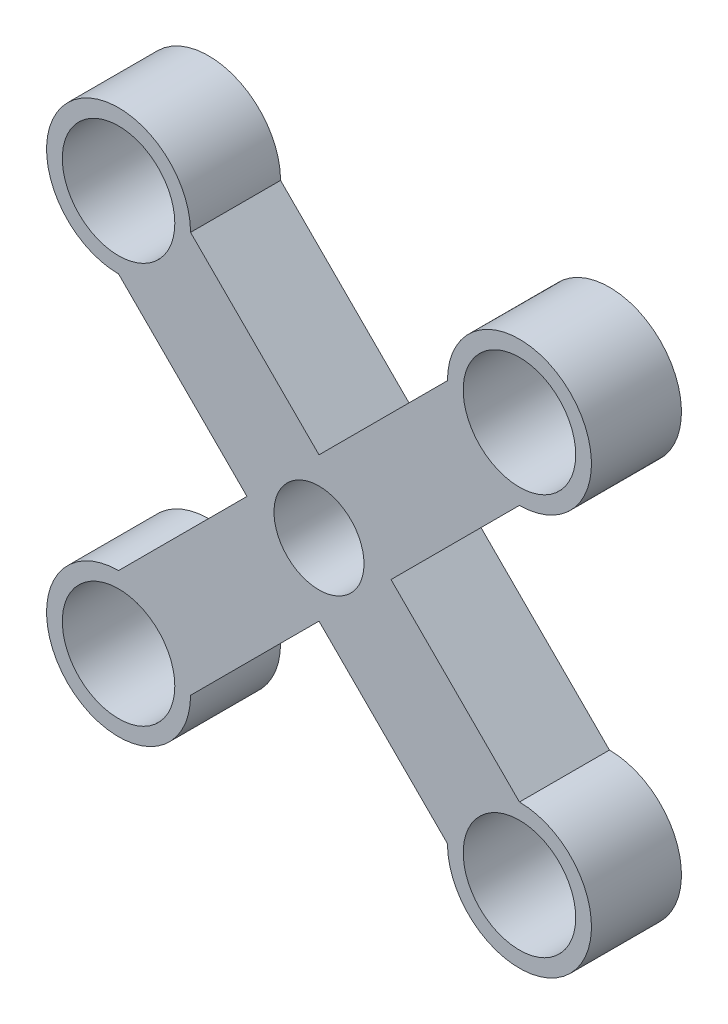
ISO-10303-21;
HEADER;
FILE_DESCRIPTION(('STEP AP214'),'2;1');
FILE_NAME('part.step','',(''),(''),'','','');
FILE_SCHEMA(('AUTOMOTIVE_DESIGN { 1 0 10303 214 1 1 1 1 }'));
ENDSEC;
DATA;
#1=APPLICATION_CONTEXT('core data for automotive mechanical design processes');
#2=APPLICATION_PROTOCOL_DEFINITION('international standard','automotive_design',2000,#1);
#3=PRODUCT_CONTEXT('',#1,'mechanical');
#4=PRODUCT('Part','Part','',(#3));
#5=PRODUCT_RELATED_PRODUCT_CATEGORY('part','',(#4));
#6=PRODUCT_DEFINITION_FORMATION('','',#4);
#7=PRODUCT_DEFINITION_CONTEXT('part definition',#1,'design');
#8=PRODUCT_DEFINITION('design','',#6,#7);
#9=PRODUCT_DEFINITION_SHAPE('','',#8);
#10=(LENGTH_UNIT() NAMED_UNIT(*) SI_UNIT(.MILLI.,.METRE.));
#11=(NAMED_UNIT(*) PLANE_ANGLE_UNIT() SI_UNIT($,.RADIAN.));
#12=(NAMED_UNIT(*) SI_UNIT($,.STERADIAN.) SOLID_ANGLE_UNIT());
#13=UNCERTAINTY_MEASURE_WITH_UNIT(LENGTH_MEASURE(1.E-05),#10,'distance_accuracy_value','');
#14=(GEOMETRIC_REPRESENTATION_CONTEXT(3) GLOBAL_UNCERTAINTY_ASSIGNED_CONTEXT((#13)) GLOBAL_UNIT_ASSIGNED_CONTEXT((#10,
#11,#12)) REPRESENTATION_CONTEXT('',''));
#15=CARTESIAN_POINT('',(0.,0.,0.));
#16=DIRECTION('',(0.,0.,1.));
#17=DIRECTION('',(1.,0.,0.));
#18=AXIS2_PLACEMENT_3D('',#15,#16,#17);
#19=CARTESIAN_POINT('',(-28.2107604692687,-28.4110048214787,12.7));
#20=DIRECTION('',(0.,0.,1.));
#21=DIRECTION('',(1.,0.,0.));
#22=AXIS2_PLACEMENT_3D('',#19,#20,#21);
#23=PLANE('',#22);
#24=CARTESIAN_POINT('',(-28.2107604692687,-28.4110048214787,12.7));
#25=DIRECTION('',(0.,0.,1.));
#26=DIRECTION('',(1.,0.,0.));
#27=AXIS2_PLACEMENT_3D('',#24,#25,#26);
#28=CIRCLE('',#27,7.9375);
#29=CARTESIAN_POINT('',(-20.2732604692687,-28.4110048214787,12.7));
#30=VERTEX_POINT('',#29);
#31=EDGE_CURVE('E305',#30,#30,#28,.T.);
#32=ORIENTED_EDGE('',*,*,#31,.F.);
#33=EDGE_LOOP('',(#32));
#34=FACE_BOUND('',#33,.T.);
#35=CARTESIAN_POINT('',(28.3576688885565,28.1574245363542,12.7));
#36=DIRECTION('',(0.,0.,1.));
#37=DIRECTION('',(1.,0.,0.));
#38=AXIS2_PLACEMENT_3D('',#35,#36,#37);
#39=CIRCLE('',#38,7.9375);
#40=CARTESIAN_POINT('',(36.2951688885565,28.1574245363542,12.7));
#41=VERTEX_POINT('',#40);
#42=EDGE_CURVE('E317',#41,#41,#39,.T.);
#43=ORIENTED_EDGE('',*,*,#42,.F.);
#44=EDGE_LOOP('',(#43));
#45=FACE_BOUND('',#44,.T.);
#46=CARTESIAN_POINT('',(-28.2107604692687,-28.4110048214787,12.7));
#47=DIRECTION('',(0.,0.,1.));
#48=DIRECTION('',(1.,0.,0.));
#49=AXIS2_PLACEMENT_3D('',#46,#47,#48);
#50=CIRCLE('',#49,10.1599999999999);
#51=CARTESIAN_POINT('',(-28.2107604692687,-18.251004821479,12.7));
#52=VERTEX_POINT('',#51);
#53=CARTESIAN_POINT('',(-18.0507604692687,-28.411004821479,12.7));
#54=VERTEX_POINT('',#53);
#55=EDGE_CURVE('E187',#52,#54,#50,.T.);
#56=ORIENTED_EDGE('',*,*,#55,.T.);
#57=DIRECTION('',(0.707106781186543,0.707106781186552,0.));
#58=VECTOR('',#57,1.);
#59=CARTESIAN_POINT('',(0.0734542096488229,-10.2867901425613,12.7));
#60=LINE('',#59,#58);
#61=CARTESIAN_POINT('',(0.0734542096488229,-10.2867901425613,12.7));
#62=VERTEX_POINT('',#61);
#63=EDGE_CURVE('E115',#54,#62,#60,.T.);
#64=ORIENTED_EDGE('',*,*,#63,.T.);
#65=DIRECTION('',(0.707106781186547,-0.707106781186547,0.));
#66=VECTOR('',#65,1.);
#67=CARTESIAN_POINT('',(18.1976688885615,-28.4110048214739,12.7));
#68=LINE('',#67,#66);
#69=CARTESIAN_POINT('',(18.1976688885616,-28.4110048214739,12.7));
#70=VERTEX_POINT('',#69);
#71=EDGE_CURVE('E214',#62,#70,#68,.T.);
#72=ORIENTED_EDGE('',*,*,#71,.T.);
#73=CARTESIAN_POINT('',(28.3576688885603,-28.4110048214739,12.7));
#74=DIRECTION('',(0.,0.,1.));
#75=DIRECTION('',(1.,0.,0.));
#76=AXIS2_PLACEMENT_3D('',#73,#74,#75);
#77=CIRCLE('',#76,10.1599999999987);
#78=CARTESIAN_POINT('',(28.3576688885601,-18.2510048214753,12.7));
#79=VERTEX_POINT('',#78);
#80=EDGE_CURVE('E233',#70,#79,#77,.T.);
#81=ORIENTED_EDGE('',*,*,#80,.T.);
#82=DIRECTION('',(-0.707106781186541,0.707106781186554,0.));
#83=VECTOR('',#82,1.);
#84=CARTESIAN_POINT('',(28.3576688885601,-18.2510048214753,12.7));
#85=LINE('',#84,#83);
#86=CARTESIAN_POINT('',(10.2334542096477,-0.126790142562578,12.7));
#87=VERTEX_POINT('',#86);
#88=EDGE_CURVE('E230',#79,#87,#85,.T.);
#89=ORIENTED_EDGE('',*,*,#88,.T.);
#90=DIRECTION('',(0.707106781186554,0.70710678118654,0.));
#91=VECTOR('',#90,1.);
#92=CARTESIAN_POINT('',(28.3576688885602,17.9974245363496,12.7));
#93=LINE('',#92,#91);
#94=CARTESIAN_POINT('',(28.3576688885602,17.9974245363496,12.7));
#95=VERTEX_POINT('',#94);
#96=EDGE_CURVE('E232',#87,#95,#93,.T.);
#97=ORIENTED_EDGE('',*,*,#96,.T.);
#98=CARTESIAN_POINT('',(28.3576688885602,28.1574245363498,12.7));
#99=DIRECTION('',(0.,0.,1.));
#100=DIRECTION('',(1.,0.,0.));
#101=AXIS2_PLACEMENT_3D('',#98,#99,#100);
#102=CIRCLE('',#101,10.1600000000002);
#103=CARTESIAN_POINT('',(18.1976688885601,28.1574245363498,12.7));
#104=VERTEX_POINT('',#103);
#105=EDGE_CURVE('E235',#95,#104,#102,.T.);
#106=ORIENTED_EDGE('',*,*,#105,.T.);
#107=DIRECTION('',(-0.707106781186548,-0.707106781186548,0.));
#108=VECTOR('',#107,1.);
#109=CARTESIAN_POINT('',(0.0734542096477156,10.0332098574374,12.7));
#110=LINE('',#109,#108);
#111=CARTESIAN_POINT('',(0.0734542096477156,10.0332098574374,12.7));
#112=VERTEX_POINT('',#111);
#113=EDGE_CURVE('E241',#104,#112,#110,.T.);
#114=ORIENTED_EDGE('',*,*,#113,.T.);
#115=DIRECTION('',(-0.707106781186547,0.707106781186547,0.));
#116=VECTOR('',#115,1.);
#117=CARTESIAN_POINT('',(0.0734542096477156,10.0332098574374,12.7));
#118=LINE('',#117,#116);
#119=CARTESIAN_POINT('',(-18.0507604692723,28.1574245363575,12.7));
#120=VERTEX_POINT('',#119);
#121=EDGE_CURVE('E146',#112,#120,#118,.T.);
#122=ORIENTED_EDGE('',*,*,#121,.T.);
#123=CARTESIAN_POINT('',(-28.2107604692709,28.1574245363571,12.7));
#124=DIRECTION('',(0.,0.,1.));
#125=DIRECTION('',(1.,0.,0.));
#126=AXIS2_PLACEMENT_3D('',#123,#124,#125);
#127=CIRCLE('',#126,10.1599999999986);
#128=CARTESIAN_POINT('',(-28.2107604692709,17.9974245363585,12.7));
#129=VERTEX_POINT('',#128);
#130=EDGE_CURVE('E140',#120,#129,#127,.T.);
#131=ORIENTED_EDGE('',*,*,#130,.T.);
#132=DIRECTION('',(0.707106781186548,-0.707106781186548,0.));
#133=VECTOR('',#132,1.);
#134=CARTESIAN_POINT('',(-10.0865457903511,-0.126790142561367,12.7));
#135=LINE('',#134,#133);
#136=CARTESIAN_POINT('',(-10.0865457903511,-0.126790142561367,12.7));
#137=VERTEX_POINT('',#136);
#138=EDGE_CURVE('E144',#129,#137,#135,.T.);
#139=ORIENTED_EDGE('',*,*,#138,.T.);
#140=DIRECTION('',(-0.707106781186548,-0.707106781186548,0.));
#141=VECTOR('',#140,1.);
#142=CARTESIAN_POINT('',(-28.2107604692687,-18.251004821479,12.7));
#143=LINE('',#142,#141);
#144=EDGE_CURVE('E60',#137,#52,#143,.T.);
#145=ORIENTED_EDGE('',*,*,#144,.T.);
#146=EDGE_LOOP('',(#56,#64,#72,#81,#89,#97,#106,#114,#122,#131,#139,#145));
#147=FACE_BOUND('',#146,.T.);
#148=CARTESIAN_POINT('',(-28.2107604692709,28.1574245363571,12.7));
#149=DIRECTION('',(0.,0.,1.));
#150=DIRECTION('',(1.,0.,0.));
#151=AXIS2_PLACEMENT_3D('',#148,#149,#150);
#152=CIRCLE('',#151,7.9375);
#153=CARTESIAN_POINT('',(-20.2732604692709,28.1574245363571,12.7));
#154=VERTEX_POINT('',#153);
#155=EDGE_CURVE('E168',#154,#154,#152,.T.);
#156=ORIENTED_EDGE('',*,*,#155,.F.);
#157=EDGE_LOOP('',(#156));
#158=FACE_BOUND('',#157,.T.);
#159=CARTESIAN_POINT('',(28.3576688885607,-28.4110048214747,12.7));
#160=DIRECTION('',(0.,0.,1.));
#161=DIRECTION('',(1.,0.,0.));
#162=AXIS2_PLACEMENT_3D('',#159,#160,#161);
#163=CIRCLE('',#162,7.9375);
#164=CARTESIAN_POINT('',(36.2951688885607,-28.4110048214747,12.7));
#165=VERTEX_POINT('',#164);
#166=EDGE_CURVE('E311',#165,#165,#163,.T.);
#167=ORIENTED_EDGE('',*,*,#166,.F.);
#168=EDGE_LOOP('',(#167));
#169=FACE_BOUND('',#168,.T.);
#170=CARTESIAN_POINT('',(0.0734542096446078,-0.126790142561978,12.7));
#171=DIRECTION('',(0.,0.,1.));
#172=DIRECTION('',(1.,0.,0.));
#173=AXIS2_PLACEMENT_3D('',#170,#171,#172);
#174=CIRCLE('',#173,6.34999999999903);
#175=CARTESIAN_POINT('',(6.42345420964364,-0.126790142561978,12.7));
#176=VERTEX_POINT('',#175);
#177=EDGE_CURVE('E296',#176,#176,#174,.T.);
#178=ORIENTED_EDGE('',*,*,#177,.F.);
#179=EDGE_LOOP('',(#178));
#180=FACE_BOUND('',#179,.T.);
#181=ADVANCED_FACE('F43',(#34,#45,#147,#158,#169,#180),#23,.T.);
#182=CARTESIAN_POINT('',(-28.2107604692687,-28.4110048214787,0.));
#183=DIRECTION('',(0.,0.,1.));
#184=DIRECTION('',(1.,0.,0.));
#185=AXIS2_PLACEMENT_3D('',#182,#183,#184);
#186=PLANE('',#185);
#187=CARTESIAN_POINT('',(-28.2107604692687,-28.4110048214787,0.));
#188=DIRECTION('',(0.,0.,1.));
#189=DIRECTION('',(1.,0.,0.));
#190=AXIS2_PLACEMENT_3D('',#187,#188,#189);
#191=CIRCLE('',#190,10.1599999999999);
#192=CARTESIAN_POINT('',(-28.2107604692687,-18.251004821479,0.));
#193=VERTEX_POINT('',#192);
#194=CARTESIAN_POINT('',(-18.0507604692687,-28.411004821479,0.));
#195=VERTEX_POINT('',#194);
#196=EDGE_CURVE('E164',#193,#195,#191,.T.);
#197=ORIENTED_EDGE('',*,*,#196,.F.);
#198=DIRECTION('',(-0.707106781186548,-0.707106781186548,0.));
#199=VECTOR('',#198,1.);
#200=CARTESIAN_POINT('',(-28.2107604692687,-18.251004821479,0.));
#201=LINE('',#200,#199);
#202=CARTESIAN_POINT('',(-10.0865457903511,-0.126790142561367,0.));
#203=VERTEX_POINT('',#202);
#204=EDGE_CURVE('E107',#203,#193,#201,.T.);
#205=ORIENTED_EDGE('',*,*,#204,.F.);
#206=DIRECTION('',(0.707106781186548,-0.707106781186548,0.));
#207=VECTOR('',#206,1.);
#208=CARTESIAN_POINT('',(-10.0865457903511,-0.126790142561367,0.));
#209=LINE('',#208,#207);
#210=CARTESIAN_POINT('',(-28.2107604692709,17.9974245363585,0.));
#211=VERTEX_POINT('',#210);
#212=EDGE_CURVE('E101',#211,#203,#209,.T.);
#213=ORIENTED_EDGE('',*,*,#212,.F.);
#214=CARTESIAN_POINT('',(-28.2107604692709,28.1574245363571,0.));
#215=DIRECTION('',(0.,0.,1.));
#216=DIRECTION('',(1.,0.,0.));
#217=AXIS2_PLACEMENT_3D('',#214,#215,#216);
#218=CIRCLE('',#217,10.1599999999986);
#219=CARTESIAN_POINT('',(-18.0507604692723,28.1574245363575,0.));
#220=VERTEX_POINT('',#219);
#221=EDGE_CURVE('E154',#220,#211,#218,.T.);
#222=ORIENTED_EDGE('',*,*,#221,.F.);
#223=DIRECTION('',(-0.707106781186547,0.707106781186547,0.));
#224=VECTOR('',#223,1.);
#225=CARTESIAN_POINT('',(0.0734542096477156,10.0332098574374,0.));
#226=LINE('',#225,#224);
#227=CARTESIAN_POINT('',(0.0734542096477156,10.0332098574374,0.));
#228=VERTEX_POINT('',#227);
#229=EDGE_CURVE('E182',#228,#220,#226,.T.);
#230=ORIENTED_EDGE('',*,*,#229,.F.);
#231=DIRECTION('',(-0.707106781186548,-0.707106781186548,0.));
#232=VECTOR('',#231,1.);
#233=CARTESIAN_POINT('',(0.0734542096477156,10.0332098574374,0.));
#234=LINE('',#233,#232);
#235=CARTESIAN_POINT('',(18.1976688885601,28.1574245363498,0.));
#236=VERTEX_POINT('',#235);
#237=EDGE_CURVE('E180',#236,#228,#234,.T.);
#238=ORIENTED_EDGE('',*,*,#237,.F.);
#239=CARTESIAN_POINT('',(28.3576688885602,28.1574245363498,0.));
#240=DIRECTION('',(0.,0.,1.));
#241=DIRECTION('',(1.,0.,0.));
#242=AXIS2_PLACEMENT_3D('',#239,#240,#241);
#243=CIRCLE('',#242,10.1600000000002);
#244=CARTESIAN_POINT('',(28.3576688885602,17.9974245363496,0.));
#245=VERTEX_POINT('',#244);
#246=EDGE_CURVE('E178',#245,#236,#243,.T.);
#247=ORIENTED_EDGE('',*,*,#246,.F.);
#248=DIRECTION('',(0.707106781186554,0.70710678118654,0.));
#249=VECTOR('',#248,1.);
#250=CARTESIAN_POINT('',(28.3576688885602,17.9974245363496,0.));
#251=LINE('',#250,#249);
#252=CARTESIAN_POINT('',(10.2334542096477,-0.126790142562578,0.));
#253=VERTEX_POINT('',#252);
#254=EDGE_CURVE('E176',#253,#245,#251,.T.);
#255=ORIENTED_EDGE('',*,*,#254,.F.);
#256=DIRECTION('',(-0.707106781186541,0.707106781186554,0.));
#257=VECTOR('',#256,1.);
#258=CARTESIAN_POINT('',(28.3576688885601,-18.2510048214753,0.));
#259=LINE('',#258,#257);
#260=CARTESIAN_POINT('',(28.3576688885601,-18.2510048214753,0.));
#261=VERTEX_POINT('',#260);
#262=EDGE_CURVE('E174',#261,#253,#259,.T.);
#263=ORIENTED_EDGE('',*,*,#262,.F.);
#264=CARTESIAN_POINT('',(28.3576688885603,-28.4110048214739,0.));
#265=DIRECTION('',(0.,0.,1.));
#266=DIRECTION('',(1.,0.,0.));
#267=AXIS2_PLACEMENT_3D('',#264,#265,#266);
#268=CIRCLE('',#267,10.1599999999987);
#269=CARTESIAN_POINT('',(18.1976688885616,-28.4110048214739,0.));
#270=VERTEX_POINT('',#269);
#271=EDGE_CURVE('E172',#270,#261,#268,.T.);
#272=ORIENTED_EDGE('',*,*,#271,.F.);
#273=DIRECTION('',(0.707106781186547,-0.707106781186547,0.));
#274=VECTOR('',#273,1.);
#275=CARTESIAN_POINT('',(18.1976688885615,-28.4110048214739,0.));
#276=LINE('',#275,#274);
#277=CARTESIAN_POINT('',(0.0734542096488229,-10.2867901425613,0.));
#278=VERTEX_POINT('',#277);
#279=EDGE_CURVE('E170',#278,#270,#276,.T.);
#280=ORIENTED_EDGE('',*,*,#279,.F.);
#281=DIRECTION('',(0.707106781186543,0.707106781186552,0.));
#282=VECTOR('',#281,1.);
#283=CARTESIAN_POINT('',(0.0734542096488229,-10.2867901425613,0.));
#284=LINE('',#283,#282);
#285=EDGE_CURVE('E167',#195,#278,#284,.T.);
#286=ORIENTED_EDGE('',*,*,#285,.F.);
#287=EDGE_LOOP('',(#197,#205,#213,#222,#230,#238,#247,#255,#263,#272,#280,#286));
#288=FACE_BOUND('',#287,.T.);
#289=CARTESIAN_POINT('',(-28.2107604692709,28.1574245363571,0.));
#290=DIRECTION('',(0.,0.,1.));
#291=DIRECTION('',(1.,0.,0.));
#292=AXIS2_PLACEMENT_3D('',#289,#290,#291);
#293=CIRCLE('',#292,7.9375);
#294=CARTESIAN_POINT('',(-20.2732604692709,28.1574245363571,0.));
#295=VERTEX_POINT('',#294);
#296=EDGE_CURVE('E320',#295,#295,#293,.T.);
#297=ORIENTED_EDGE('',*,*,#296,.T.);
#298=EDGE_LOOP('',(#297));
#299=FACE_BOUND('',#298,.T.);
#300=CARTESIAN_POINT('',(28.3576688885565,28.1574245363542,0.));
#301=DIRECTION('',(0.,0.,1.));
#302=DIRECTION('',(1.,0.,0.));
#303=AXIS2_PLACEMENT_3D('',#300,#301,#302);
#304=CIRCLE('',#303,7.9375);
#305=CARTESIAN_POINT('',(36.2951688885565,28.1574245363542,0.));
#306=VERTEX_POINT('',#305);
#307=EDGE_CURVE('E314',#306,#306,#304,.T.);
#308=ORIENTED_EDGE('',*,*,#307,.T.);
#309=EDGE_LOOP('',(#308));
#310=FACE_BOUND('',#309,.T.);
#311=CARTESIAN_POINT('',(28.3576688885607,-28.4110048214747,0.));
#312=DIRECTION('',(0.,0.,1.));
#313=DIRECTION('',(1.,0.,0.));
#314=AXIS2_PLACEMENT_3D('',#311,#312,#313);
#315=CIRCLE('',#314,7.9375);
#316=CARTESIAN_POINT('',(36.2951688885607,-28.4110048214747,0.));
#317=VERTEX_POINT('',#316);
#318=EDGE_CURVE('E308',#317,#317,#315,.T.);
#319=ORIENTED_EDGE('',*,*,#318,.T.);
#320=EDGE_LOOP('',(#319));
#321=FACE_BOUND('',#320,.T.);
#322=CARTESIAN_POINT('',(-28.2107604692687,-28.4110048214787,0.));
#323=DIRECTION('',(0.,0.,1.));
#324=DIRECTION('',(1.,0.,0.));
#325=AXIS2_PLACEMENT_3D('',#322,#323,#324);
#326=CIRCLE('',#325,7.9375);
#327=CARTESIAN_POINT('',(-20.2732604692687,-28.4110048214787,0.));
#328=VERTEX_POINT('',#327);
#329=EDGE_CURVE('E302',#328,#328,#326,.T.);
#330=ORIENTED_EDGE('',*,*,#329,.T.);
#331=EDGE_LOOP('',(#330));
#332=FACE_BOUND('',#331,.T.);
#333=CARTESIAN_POINT('',(0.0734542096446078,-0.126790142561978,0.));
#334=DIRECTION('',(0.,0.,1.));
#335=DIRECTION('',(1.,0.,0.));
#336=AXIS2_PLACEMENT_3D('',#333,#334,#335);
#337=CIRCLE('',#336,6.34999999999903);
#338=CARTESIAN_POINT('',(6.42345420964364,-0.126790142561978,0.));
#339=VERTEX_POINT('',#338);
#340=EDGE_CURVE('E299',#339,#339,#337,.T.);
#341=ORIENTED_EDGE('',*,*,#340,.T.);
#342=EDGE_LOOP('',(#341));
#343=FACE_BOUND('',#342,.T.);
#344=ADVANCED_FACE('F218',(#288,#299,#310,#321,#332,#343),#186,.F.);
#345=CARTESIAN_POINT('',(-28.2107604692687,-28.4110048214787,12.7));
#346=DIRECTION('',(0.,0.,-1.));
#347=DIRECTION('',(-1.,0.,0.));
#348=AXIS2_PLACEMENT_3D('',#345,#346,#347);
#349=CYLINDRICAL_SURFACE('',#348,10.1599999999999);
#350=ORIENTED_EDGE('',*,*,#196,.T.);
#351=DIRECTION('',(0.,0.,-1.));
#352=VECTOR('',#351,1.);
#353=CARTESIAN_POINT('',(-18.0507604692687,-28.411004821479,12.7));
#354=LINE('',#353,#352);
#355=EDGE_CURVE('E11',#54,#195,#354,.T.);
#356=ORIENTED_EDGE('',*,*,#355,.F.);
#357=ORIENTED_EDGE('',*,*,#55,.F.);
#358=DIRECTION('',(0.,0.,-1.));
#359=VECTOR('',#358,1.);
#360=CARTESIAN_POINT('',(-28.2107604692687,-18.251004821479,12.7));
#361=LINE('',#360,#359);
#362=EDGE_CURVE('E160',#52,#193,#361,.T.);
#363=ORIENTED_EDGE('',*,*,#362,.T.);
#364=EDGE_LOOP('',(#350,#356,#357,#363));
#365=FACE_BOUND('',#364,.T.);
#366=ADVANCED_FACE('F45',(#365),#349,.T.);
#367=CARTESIAN_POINT('',(0.0734542096488229,-10.2867901425613,12.7));
#368=DIRECTION('',(-0.707106781186552,0.707106781186543,0.));
#369=DIRECTION('',(-0.707106781186543,-0.707106781186552,0.));
#370=AXIS2_PLACEMENT_3D('',#367,#368,#369);
#371=PLANE('',#370);
#372=ORIENTED_EDGE('',*,*,#285,.T.);
#373=DIRECTION('',(0.,0.,-1.));
#374=VECTOR('',#373,1.);
#375=CARTESIAN_POINT('',(0.0734542096488229,-10.2867901425613,12.7));
#376=LINE('',#375,#374);
#377=EDGE_CURVE('E52',#62,#278,#376,.T.);
#378=ORIENTED_EDGE('',*,*,#377,.F.);
#379=ORIENTED_EDGE('',*,*,#63,.F.);
#380=ORIENTED_EDGE('',*,*,#355,.T.);
#381=EDGE_LOOP('',(#372,#378,#379,#380));
#382=FACE_BOUND('',#381,.T.);
#383=ADVANCED_FACE('F444',(#382),#371,.F.);
#384=CARTESIAN_POINT('',(18.1976688885615,-28.4110048214739,12.7));
#385=DIRECTION('',(0.707106781186548,0.707106781186548,0.));
#386=DIRECTION('',(-0.707106781186548,0.707106781186548,0.));
#387=AXIS2_PLACEMENT_3D('',#384,#385,#386);
#388=PLANE('',#387);
#389=ORIENTED_EDGE('',*,*,#279,.T.);
#390=DIRECTION('',(0.,0.,-1.));
#391=VECTOR('',#390,1.);
#392=CARTESIAN_POINT('',(18.1976688885616,-28.4110048214739,12.7));
#393=LINE('',#392,#391);
#394=EDGE_CURVE('E206',#70,#270,#393,.T.);
#395=ORIENTED_EDGE('',*,*,#394,.F.);
#396=ORIENTED_EDGE('',*,*,#71,.F.);
#397=ORIENTED_EDGE('',*,*,#377,.T.);
#398=EDGE_LOOP('',(#389,#395,#396,#397));
#399=FACE_BOUND('',#398,.T.);
#400=ADVANCED_FACE('F212',(#399),#388,.F.);
#401=CARTESIAN_POINT('',(28.3576688885603,-28.4110048214739,12.7));
#402=DIRECTION('',(0.,0.,-1.));
#403=DIRECTION('',(-1.,0.,0.));
#404=AXIS2_PLACEMENT_3D('',#401,#402,#403);
#405=CYLINDRICAL_SURFACE('',#404,10.1599999999987);
#406=ORIENTED_EDGE('',*,*,#271,.T.);
#407=DIRECTION('',(0.,0.,-1.));
#408=VECTOR('',#407,1.);
#409=CARTESIAN_POINT('',(28.3576688885601,-18.2510048214753,12.7));
#410=LINE('',#409,#408);
#411=EDGE_CURVE('E203',#79,#261,#410,.T.);
#412=ORIENTED_EDGE('',*,*,#411,.F.);
#413=ORIENTED_EDGE('',*,*,#80,.F.);
#414=ORIENTED_EDGE('',*,*,#394,.T.);
#415=EDGE_LOOP('',(#406,#412,#413,#414));
#416=FACE_BOUND('',#415,.T.);
#417=ADVANCED_FACE('F224',(#416),#405,.T.);
#418=CARTESIAN_POINT('',(28.3576688885601,-18.2510048214753,12.7));
#419=DIRECTION('',(-0.707106781186554,-0.707106781186541,0.));
#420=DIRECTION('',(0.707106781186541,-0.707106781186554,0.));
#421=AXIS2_PLACEMENT_3D('',#418,#419,#420);
#422=PLANE('',#421);
#423=ORIENTED_EDGE('',*,*,#262,.T.);
#424=DIRECTION('',(0.,0.,-1.));
#425=VECTOR('',#424,1.);
#426=CARTESIAN_POINT('',(10.2334542096477,-0.126790142562578,12.7));
#427=LINE('',#426,#425);
#428=EDGE_CURVE('E200',#87,#253,#427,.T.);
#429=ORIENTED_EDGE('',*,*,#428,.F.);
#430=ORIENTED_EDGE('',*,*,#88,.F.);
#431=ORIENTED_EDGE('',*,*,#411,.T.);
#432=EDGE_LOOP('',(#423,#429,#430,#431));
#433=FACE_BOUND('',#432,.T.);
#434=ADVANCED_FACE('F228',(#433),#422,.F.);
#435=CARTESIAN_POINT('',(28.3576688885602,17.9974245363496,12.7));
#436=DIRECTION('',(-0.707106781186541,0.707106781186554,0.));
#437=DIRECTION('',(-0.707106781186554,-0.707106781186541,0.));
#438=AXIS2_PLACEMENT_3D('',#435,#436,#437);
#439=PLANE('',#438);
#440=ORIENTED_EDGE('',*,*,#254,.T.);
#441=DIRECTION('',(0.,0.,-1.));
#442=VECTOR('',#441,1.);
#443=CARTESIAN_POINT('',(28.3576688885602,17.9974245363496,12.7));
#444=LINE('',#443,#442);
#445=EDGE_CURVE('E197',#95,#245,#444,.T.);
#446=ORIENTED_EDGE('',*,*,#445,.F.);
#447=ORIENTED_EDGE('',*,*,#96,.F.);
#448=ORIENTED_EDGE('',*,*,#428,.T.);
#449=EDGE_LOOP('',(#440,#446,#447,#448));
#450=FACE_BOUND('',#449,.T.);
#451=ADVANCED_FACE('F409',(#450),#439,.F.);
#452=CARTESIAN_POINT('',(28.3576688885602,28.1574245363498,12.7));
#453=DIRECTION('',(0.,0.,-1.));
#454=DIRECTION('',(-1.,0.,0.));
#455=AXIS2_PLACEMENT_3D('',#452,#453,#454);
#456=CYLINDRICAL_SURFACE('',#455,10.1600000000002);
#457=ORIENTED_EDGE('',*,*,#246,.T.);
#458=DIRECTION('',(0.,0.,-1.));
#459=VECTOR('',#458,1.);
#460=CARTESIAN_POINT('',(18.1976688885601,28.1574245363498,12.7));
#461=LINE('',#460,#459);
#462=EDGE_CURVE('E194',#104,#236,#461,.T.);
#463=ORIENTED_EDGE('',*,*,#462,.F.);
#464=ORIENTED_EDGE('',*,*,#105,.F.);
#465=ORIENTED_EDGE('',*,*,#445,.T.);
#466=EDGE_LOOP('',(#457,#463,#464,#465));
#467=FACE_BOUND('',#466,.T.);
#468=ADVANCED_FACE('F400',(#467),#456,.T.);
#469=CARTESIAN_POINT('',(0.0734542096477156,10.0332098574374,12.7));
#470=DIRECTION('',(0.707106781186548,-0.707106781186548,0.));
#471=DIRECTION('',(0.707106781186548,0.707106781186548,0.));
#472=AXIS2_PLACEMENT_3D('',#469,#470,#471);
#473=PLANE('',#472);
#474=ORIENTED_EDGE('',*,*,#237,.T.);
#475=DIRECTION('',(0.,0.,-1.));
#476=VECTOR('',#475,1.);
#477=CARTESIAN_POINT('',(0.0734542096477156,10.0332098574374,12.7));
#478=LINE('',#477,#476);
#479=EDGE_CURVE('E191',#112,#228,#478,.T.);
#480=ORIENTED_EDGE('',*,*,#479,.F.);
#481=ORIENTED_EDGE('',*,*,#113,.F.);
#482=ORIENTED_EDGE('',*,*,#462,.T.);
#483=EDGE_LOOP('',(#474,#480,#481,#482));
#484=FACE_BOUND('',#483,.T.);
#485=ADVANCED_FACE('F247',(#484),#473,.F.);
#486=CARTESIAN_POINT('',(0.0734542096477156,10.0332098574374,12.7));
#487=DIRECTION('',(-0.707106781186548,-0.707106781186548,0.));
#488=DIRECTION('',(0.707106781186548,-0.707106781186548,0.));
#489=AXIS2_PLACEMENT_3D('',#486,#487,#488);
#490=PLANE('',#489);
#491=ORIENTED_EDGE('',*,*,#229,.T.);
#492=DIRECTION('',(0.,0.,-1.));
#493=VECTOR('',#492,1.);
#494=CARTESIAN_POINT('',(-18.0507604692723,28.1574245363575,12.7));
#495=LINE('',#494,#493);
#496=EDGE_CURVE('E155',#120,#220,#495,.T.);
#497=ORIENTED_EDGE('',*,*,#496,.F.);
#498=ORIENTED_EDGE('',*,*,#121,.F.);
#499=ORIENTED_EDGE('',*,*,#479,.T.);
#500=EDGE_LOOP('',(#491,#497,#498,#499));
#501=FACE_BOUND('',#500,.T.);
#502=ADVANCED_FACE('F251',(#501),#490,.F.);
#503=CARTESIAN_POINT('',(-28.2107604692709,28.1574245363571,12.7));
#504=DIRECTION('',(0.,0.,-1.));
#505=DIRECTION('',(-1.,0.,0.));
#506=AXIS2_PLACEMENT_3D('',#503,#504,#505);
#507=CYLINDRICAL_SURFACE('',#506,10.1599999999986);
#508=ORIENTED_EDGE('',*,*,#221,.T.);
#509=DIRECTION('',(0.,0.,-1.));
#510=VECTOR('',#509,1.);
#511=CARTESIAN_POINT('',(-28.2107604692709,17.9974245363585,12.7));
#512=LINE('',#511,#510);
#513=EDGE_CURVE('E151',#129,#211,#512,.T.);
#514=ORIENTED_EDGE('',*,*,#513,.F.);
#515=ORIENTED_EDGE('',*,*,#130,.F.);
#516=ORIENTED_EDGE('',*,*,#496,.T.);
#517=EDGE_LOOP('',(#508,#514,#515,#516));
#518=FACE_BOUND('',#517,.T.);
#519=ADVANCED_FACE('F152',(#518),#507,.T.);
#520=CARTESIAN_POINT('',(-10.0865457903511,-0.126790142561367,12.7));
#521=DIRECTION('',(0.707106781186548,0.707106781186548,0.));
#522=DIRECTION('',(-0.707106781186548,0.707106781186548,0.));
#523=AXIS2_PLACEMENT_3D('',#520,#521,#522);
#524=PLANE('',#523);
#525=ORIENTED_EDGE('',*,*,#212,.T.);
#526=DIRECTION('',(0.,0.,-1.));
#527=VECTOR('',#526,1.);
#528=CARTESIAN_POINT('',(-10.0865457903511,-0.126790142561367,12.7));
#529=LINE('',#528,#527);
#530=EDGE_CURVE('E156',#137,#203,#529,.T.);
#531=ORIENTED_EDGE('',*,*,#530,.F.);
#532=ORIENTED_EDGE('',*,*,#138,.F.);
#533=ORIENTED_EDGE('',*,*,#513,.T.);
#534=EDGE_LOOP('',(#525,#531,#532,#533));
#535=FACE_BOUND('',#534,.T.);
#536=ADVANCED_FACE('F158',(#535),#524,.F.);
#537=CARTESIAN_POINT('',(-28.2107604692687,-18.251004821479,12.7));
#538=DIRECTION('',(0.707106781186548,-0.707106781186548,0.));
#539=DIRECTION('',(0.707106781186548,0.707106781186548,0.));
#540=AXIS2_PLACEMENT_3D('',#537,#538,#539);
#541=PLANE('',#540);
#542=ORIENTED_EDGE('',*,*,#204,.T.);
#543=ORIENTED_EDGE('',*,*,#362,.F.);
#544=ORIENTED_EDGE('',*,*,#144,.F.);
#545=ORIENTED_EDGE('',*,*,#530,.T.);
#546=EDGE_LOOP('',(#542,#543,#544,#545));
#547=FACE_BOUND('',#546,.T.);
#548=ADVANCED_FACE('F255',(#547),#541,.F.);
#549=CARTESIAN_POINT('',(-28.2107604692709,28.1574245363571,12.7));
#550=DIRECTION('',(0.,0.,-1.));
#551=DIRECTION('',(-1.,0.,0.));
#552=AXIS2_PLACEMENT_3D('',#549,#550,#551);
#553=CYLINDRICAL_SURFACE('',#552,7.9375);
#554=ORIENTED_EDGE('',*,*,#155,.T.);
#555=EDGE_LOOP('',(#554));
#556=FACE_BOUND('',#555,.T.);
#557=ORIENTED_EDGE('',*,*,#296,.F.);
#558=EDGE_LOOP('',(#557));
#559=FACE_BOUND('',#558,.T.);
#560=ADVANCED_FACE('F257',(#556,#559),#553,.F.);
#561=CARTESIAN_POINT('',(28.3576688885565,28.1574245363542,12.7));
#562=DIRECTION('',(0.,0.,-1.));
#563=DIRECTION('',(-1.,0.,0.));
#564=AXIS2_PLACEMENT_3D('',#561,#562,#563);
#565=CYLINDRICAL_SURFACE('',#564,7.9375);
#566=ORIENTED_EDGE('',*,*,#42,.T.);
#567=EDGE_LOOP('',(#566));
#568=FACE_BOUND('',#567,.T.);
#569=ORIENTED_EDGE('',*,*,#307,.F.);
#570=EDGE_LOOP('',(#569));
#571=FACE_BOUND('',#570,.T.);
#572=ADVANCED_FACE('F263',(#568,#571),#565,.F.);
#573=CARTESIAN_POINT('',(28.3576688885607,-28.4110048214747,12.7));
#574=DIRECTION('',(0.,0.,-1.));
#575=DIRECTION('',(-1.,0.,0.));
#576=AXIS2_PLACEMENT_3D('',#573,#574,#575);
#577=CYLINDRICAL_SURFACE('',#576,7.9375);
#578=ORIENTED_EDGE('',*,*,#166,.T.);
#579=EDGE_LOOP('',(#578));
#580=FACE_BOUND('',#579,.T.);
#581=ORIENTED_EDGE('',*,*,#318,.F.);
#582=EDGE_LOOP('',(#581));
#583=FACE_BOUND('',#582,.T.);
#584=ADVANCED_FACE('F279',(#580,#583),#577,.F.);
#585=CARTESIAN_POINT('',(-28.2107604692687,-28.4110048214787,12.7));
#586=DIRECTION('',(0.,0.,-1.));
#587=DIRECTION('',(-1.,0.,0.));
#588=AXIS2_PLACEMENT_3D('',#585,#586,#587);
#589=CYLINDRICAL_SURFACE('',#588,7.9375);
#590=ORIENTED_EDGE('',*,*,#31,.T.);
#591=EDGE_LOOP('',(#590));
#592=FACE_BOUND('',#591,.T.);
#593=ORIENTED_EDGE('',*,*,#329,.F.);
#594=EDGE_LOOP('',(#593));
#595=FACE_BOUND('',#594,.T.);
#596=ADVANCED_FACE('F283',(#592,#595),#589,.F.);
#597=CARTESIAN_POINT('',(0.0734542096446078,-0.126790142561978,12.7));
#598=DIRECTION('',(0.,0.,-1.));
#599=DIRECTION('',(-1.,0.,0.));
#600=AXIS2_PLACEMENT_3D('',#597,#598,#599);
#601=CYLINDRICAL_SURFACE('',#600,6.34999999999903);
#602=ORIENTED_EDGE('',*,*,#177,.T.);
#603=EDGE_LOOP('',(#602));
#604=FACE_BOUND('',#603,.T.);
#605=ORIENTED_EDGE('',*,*,#340,.F.);
#606=EDGE_LOOP('',(#605));
#607=FACE_BOUND('',#606,.T.);
#608=ADVANCED_FACE('F287',(#604,#607),#601,.F.);
#609=CLOSED_SHELL('',(#181,#344,#366,#383,#400,#417,#434,#451,#468,#485,#502,#519,#536,#548,
#560,#572,#584,#596,#608));
#610=MANIFOLD_SOLID_BREP('B2',#609);
#611=ADVANCED_BREP_SHAPE_REPRESENTATION('',(#18,#610),#14);
#612=SHAPE_DEFINITION_REPRESENTATION(#9,#611);
ENDSEC;
END-ISO-10303-21;
